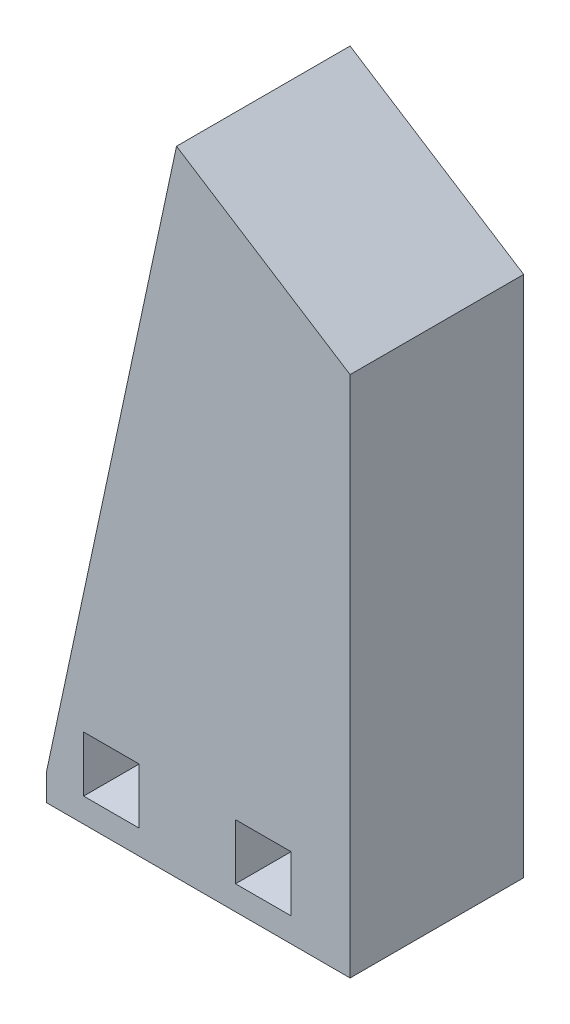
ISO-10303-21;
HEADER;
FILE_DESCRIPTION(('STEP AP214'),'2;1');
FILE_NAME('part.step','',(''),(''),'','','');
FILE_SCHEMA(('AUTOMOTIVE_DESIGN { 1 0 10303 214 1 1 1 1 }'));
ENDSEC;
DATA;
#1=APPLICATION_CONTEXT('core data for automotive mechanical design processes');
#2=APPLICATION_PROTOCOL_DEFINITION('international standard','automotive_design',2000,#1);
#3=PRODUCT_CONTEXT('',#1,'mechanical');
#4=PRODUCT('Part','Part','',(#3));
#5=PRODUCT_RELATED_PRODUCT_CATEGORY('part','',(#4));
#6=PRODUCT_DEFINITION_FORMATION('','',#4);
#7=PRODUCT_DEFINITION_CONTEXT('part definition',#1,'design');
#8=PRODUCT_DEFINITION('design','',#6,#7);
#9=PRODUCT_DEFINITION_SHAPE('','',#8);
#10=(LENGTH_UNIT() NAMED_UNIT(*) SI_UNIT(.MILLI.,.METRE.));
#11=(NAMED_UNIT(*) PLANE_ANGLE_UNIT() SI_UNIT($,.RADIAN.));
#12=(NAMED_UNIT(*) SI_UNIT($,.STERADIAN.) SOLID_ANGLE_UNIT());
#13=UNCERTAINTY_MEASURE_WITH_UNIT(LENGTH_MEASURE(1.E-05),#10,'distance_accuracy_value','');
#14=(GEOMETRIC_REPRESENTATION_CONTEXT(3) GLOBAL_UNCERTAINTY_ASSIGNED_CONTEXT((#13)) GLOBAL_UNIT_ASSIGNED_CONTEXT((#10,
#11,#12)) REPRESENTATION_CONTEXT('',''));
#15=CARTESIAN_POINT('',(0.,0.,0.));
#16=DIRECTION('',(0.,0.,1.));
#17=DIRECTION('',(1.,0.,0.));
#18=AXIS2_PLACEMENT_3D('',#15,#16,#17);
#19=CARTESIAN_POINT('',(0.,-72.9955774548661,20.));
#20=DIRECTION('',(0.,1.,0.));
#21=DIRECTION('',(0.,0.,1.));
#22=AXIS2_PLACEMENT_3D('',#19,#20,#21);
#23=PLANE('',#22);
#24=CARTESIAN_POINT('',(10.,-72.9955774548661,10.));
#25=DIRECTION('',(0.,-1.,0.));
#26=DIRECTION('',(0.,0.,-1.));
#27=AXIS2_PLACEMENT_3D('',#24,#25,#26);
#28=CIRCLE('',#27,1.6);
#29=CARTESIAN_POINT('',(10.,-72.9955774548661,8.4));
#30=VERTEX_POINT('',#29);
#31=EDGE_CURVE('E235',#30,#30,#28,.T.);
#32=ORIENTED_EDGE('',*,*,#31,.F.);
#33=EDGE_LOOP('',(#32));
#34=FACE_BOUND('',#33,.T.);
#35=CARTESIAN_POINT('',(-7.5,-72.9955774548661,10.));
#36=DIRECTION('',(0.,-1.,0.));
#37=DIRECTION('',(0.,0.,-1.));
#38=AXIS2_PLACEMENT_3D('',#35,#36,#37);
#39=CIRCLE('',#38,1.6);
#40=CARTESIAN_POINT('',(-7.5,-72.9955774548661,8.4));
#41=VERTEX_POINT('',#40);
#42=EDGE_CURVE('E240',#41,#41,#39,.T.);
#43=ORIENTED_EDGE('',*,*,#42,.F.);
#44=EDGE_LOOP('',(#43));
#45=FACE_BOUND('',#44,.T.);
#46=DIRECTION('',(1.,0.,0.));
#47=VECTOR('',#46,1.);
#48=CARTESIAN_POINT('',(0.,-72.9955774548661,0.));
#49=LINE('',#48,#47);
#50=CARTESIAN_POINT('',(-15.,-72.9955774548661,0.));
#51=VERTEX_POINT('',#50);
#52=CARTESIAN_POINT('',(20.,-72.9955774548661,0.));
#53=VERTEX_POINT('',#52);
#54=EDGE_CURVE('E208',#51,#53,#49,.T.);
#55=ORIENTED_EDGE('',*,*,#54,.T.);
#56=DIRECTION('',(0.,0.,-1.));
#57=VECTOR('',#56,1.);
#58=CARTESIAN_POINT('',(20.,-72.9955774548661,20.));
#59=LINE('',#58,#57);
#60=CARTESIAN_POINT('',(20.,-72.9955774548661,20.));
#61=VERTEX_POINT('',#60);
#62=EDGE_CURVE('E12',#61,#53,#59,.T.);
#63=ORIENTED_EDGE('',*,*,#62,.F.);
#64=DIRECTION('',(1.,0.,0.));
#65=VECTOR('',#64,1.);
#66=CARTESIAN_POINT('',(0.,-72.9955774548661,20.));
#67=LINE('',#66,#65);
#68=CARTESIAN_POINT('',(-15.,-72.9955774548661,20.));
#69=VERTEX_POINT('',#68);
#70=EDGE_CURVE('E218',#69,#61,#67,.T.);
#71=ORIENTED_EDGE('',*,*,#70,.F.);
#72=DIRECTION('',(0.,0.,1.));
#73=VECTOR('',#72,1.);
#74=CARTESIAN_POINT('',(-15.,-72.9955774548661,-74.5208315034753));
#75=LINE('',#74,#73);
#76=EDGE_CURVE('E206',#51,#69,#75,.T.);
#77=ORIENTED_EDGE('',*,*,#76,.F.);
#78=EDGE_LOOP('',(#55,#63,#71,#77));
#79=FACE_BOUND('',#78,.T.);
#80=ADVANCED_FACE('F43',(#34,#45,#79),#23,.F.);
#81=CARTESIAN_POINT('',(20.,-12.7905336116527,20.));
#82=DIRECTION('',(-1.,0.,0.));
#83=DIRECTION('',(0.,-1.,0.));
#84=AXIS2_PLACEMENT_3D('',#81,#82,#83);
#85=PLANE('',#84);
#86=DIRECTION('',(0.,1.,0.));
#87=VECTOR('',#86,1.);
#88=CARTESIAN_POINT('',(20.,-12.7905336116527,0.));
#89=LINE('',#88,#87);
#90=CARTESIAN_POINT('',(20.,-12.7905336116527,0.));
#91=VERTEX_POINT('',#90);
#92=EDGE_CURVE('E227',#53,#91,#89,.T.);
#93=ORIENTED_EDGE('',*,*,#92,.T.);
#94=DIRECTION('',(0.,0.,-1.));
#95=VECTOR('',#94,1.);
#96=CARTESIAN_POINT('',(20.,-12.7905336116527,20.));
#97=LINE('',#96,#95);
#98=CARTESIAN_POINT('',(20.,-12.7905336116527,20.));
#99=VERTEX_POINT('',#98);
#100=EDGE_CURVE('E51',#99,#91,#97,.T.);
#101=ORIENTED_EDGE('',*,*,#100,.F.);
#102=DIRECTION('',(0.,1.,0.));
#103=VECTOR('',#102,1.);
#104=CARTESIAN_POINT('',(20.,-12.7905336116527,20.));
#105=LINE('',#104,#103);
#106=EDGE_CURVE('E220',#61,#99,#105,.T.);
#107=ORIENTED_EDGE('',*,*,#106,.F.);
#108=ORIENTED_EDGE('',*,*,#62,.T.);
#109=EDGE_LOOP('',(#93,#101,#107,#108));
#110=FACE_BOUND('',#109,.T.);
#111=ADVANCED_FACE('F271',(#110),#85,.F.);
#112=CARTESIAN_POINT('',(0.,0.,20.));
#113=DIRECTION('',(-0.538770785006864,-0.842452397007147,0.));
#114=DIRECTION('',(0.842452397007147,-0.538770785006864,0.));
#115=AXIS2_PLACEMENT_3D('',#112,#113,#114);
#116=PLANE('',#115);
#117=DIRECTION('',(-0.842452397007147,0.538770785006864,0.));
#118=VECTOR('',#117,1.);
#119=CARTESIAN_POINT('',(0.,0.,0.));
#120=LINE('',#119,#118);
#121=CARTESIAN_POINT('',(0.,0.,0.));
#122=VERTEX_POINT('',#121);
#123=EDGE_CURVE('E221',#91,#122,#120,.T.);
#124=ORIENTED_EDGE('',*,*,#123,.T.);
#125=DIRECTION('',(0.,0.,-1.));
#126=VECTOR('',#125,1.);
#127=CARTESIAN_POINT('',(0.,0.,20.));
#128=LINE('',#127,#126);
#129=CARTESIAN_POINT('',(0.,0.,20.));
#130=VERTEX_POINT('',#129);
#131=EDGE_CURVE('E225',#130,#122,#128,.T.);
#132=ORIENTED_EDGE('',*,*,#131,.F.);
#133=DIRECTION('',(-0.842452397007147,0.538770785006864,0.));
#134=VECTOR('',#133,1.);
#135=CARTESIAN_POINT('',(0.,0.,20.));
#136=LINE('',#135,#134);
#137=EDGE_CURVE('E223',#99,#130,#136,.T.);
#138=ORIENTED_EDGE('',*,*,#137,.F.);
#139=ORIENTED_EDGE('',*,*,#100,.T.);
#140=EDGE_LOOP('',(#124,#132,#138,#139));
#141=FACE_BOUND('',#140,.T.);
#142=ADVANCED_FACE('F278',(#141),#116,.F.);
#143=CARTESIAN_POINT('',(0.,0.,20.));
#144=DIRECTION('',(0.,0.,1.));
#145=DIRECTION('',(1.,0.,0.));
#146=AXIS2_PLACEMENT_3D('',#143,#144,#145);
#147=PLANE('',#146);
#148=DIRECTION('',(-1.,0.,0.));
#149=VECTOR('',#148,1.);
#150=CARTESIAN_POINT('',(-10.7,-63.7955774548661,20.));
#151=LINE('',#150,#149);
#152=CARTESIAN_POINT('',(-4.3,-63.7955774548661,20.));
#153=VERTEX_POINT('',#152);
#154=CARTESIAN_POINT('',(-10.7,-63.7955774548661,20.));
#155=VERTEX_POINT('',#154);
#156=EDGE_CURVE('E59',#153,#155,#151,.T.);
#157=ORIENTED_EDGE('',*,*,#156,.F.);
#158=DIRECTION('',(0.,1.,0.));
#159=VECTOR('',#158,1.);
#160=CARTESIAN_POINT('',(-4.3,-63.7955774548661,20.));
#161=LINE('',#160,#159);
#162=CARTESIAN_POINT('',(-4.3,-70.1955774548661,20.));
#163=VERTEX_POINT('',#162);
#164=EDGE_CURVE('E163',#163,#153,#161,.T.);
#165=ORIENTED_EDGE('',*,*,#164,.F.);
#166=DIRECTION('',(1.,0.,0.));
#167=VECTOR('',#166,1.);
#168=CARTESIAN_POINT('',(-10.7,-70.1955774548661,20.));
#169=LINE('',#168,#167);
#170=CARTESIAN_POINT('',(-10.7,-70.1955774548661,20.));
#171=VERTEX_POINT('',#170);
#172=EDGE_CURVE('E146',#171,#163,#169,.T.);
#173=ORIENTED_EDGE('',*,*,#172,.F.);
#174=DIRECTION('',(0.,-1.,0.));
#175=VECTOR('',#174,1.);
#176=CARTESIAN_POINT('',(-10.7,-63.7955774548661,20.));
#177=LINE('',#176,#175);
#178=EDGE_CURVE('E156',#155,#171,#177,.T.);
#179=ORIENTED_EDGE('',*,*,#178,.F.);
#180=EDGE_LOOP('',(#157,#165,#173,#179));
#181=FACE_BOUND('',#180,.T.);
#182=DIRECTION('',(-1.,0.,0.));
#183=VECTOR('',#182,1.);
#184=CARTESIAN_POINT('',(6.80000000000001,-63.7955774548661,20.));
#185=LINE('',#184,#183);
#186=CARTESIAN_POINT('',(13.2,-63.7955774548661,20.));
#187=VERTEX_POINT('',#186);
#188=CARTESIAN_POINT('',(6.80000000000001,-63.7955774548661,20.));
#189=VERTEX_POINT('',#188);
#190=EDGE_CURVE('E67',#187,#189,#185,.T.);
#191=ORIENTED_EDGE('',*,*,#190,.F.);
#192=DIRECTION('',(0.,1.,0.));
#193=VECTOR('',#192,1.);
#194=CARTESIAN_POINT('',(13.2,-63.7955774548661,20.));
#195=LINE('',#194,#193);
#196=CARTESIAN_POINT('',(13.2,-70.1955774548661,20.));
#197=VERTEX_POINT('',#196);
#198=EDGE_CURVE('E181',#197,#187,#195,.T.);
#199=ORIENTED_EDGE('',*,*,#198,.F.);
#200=DIRECTION('',(1.,0.,0.));
#201=VECTOR('',#200,1.);
#202=CARTESIAN_POINT('',(6.80000000000001,-70.1955774548661,20.));
#203=LINE('',#202,#201);
#204=CARTESIAN_POINT('',(6.80000000000001,-70.1955774548661,20.));
#205=VERTEX_POINT('',#204);
#206=EDGE_CURVE('E191',#205,#197,#203,.T.);
#207=ORIENTED_EDGE('',*,*,#206,.F.);
#208=DIRECTION('',(0.,-1.,0.));
#209=VECTOR('',#208,1.);
#210=CARTESIAN_POINT('',(6.80000000000001,-63.7955774548661,20.));
#211=LINE('',#210,#209);
#212=EDGE_CURVE('E194',#189,#205,#211,.T.);
#213=ORIENTED_EDGE('',*,*,#212,.F.);
#214=EDGE_LOOP('',(#191,#199,#207,#213));
#215=FACE_BOUND('',#214,.T.);
#216=ORIENTED_EDGE('',*,*,#137,.T.);
#217=DIRECTION('',(-0.209541746186117,-0.977799701679885,0.));
#218=VECTOR('',#217,1.);
#219=CARTESIAN_POINT('',(-15.,-69.9955774548661,20.));
#220=LINE('',#219,#218);
#221=CARTESIAN_POINT('',(-15.,-69.9955774548661,20.));
#222=VERTEX_POINT('',#221);
#223=EDGE_CURVE('E174',#130,#222,#220,.T.);
#224=ORIENTED_EDGE('',*,*,#223,.T.);
#225=DIRECTION('',(0.,-1.,0.));
#226=VECTOR('',#225,1.);
#227=CARTESIAN_POINT('',(-15.,-72.9955774548661,20.));
#228=LINE('',#227,#226);
#229=EDGE_CURVE('E211',#222,#69,#228,.T.);
#230=ORIENTED_EDGE('',*,*,#229,.T.);
#231=ORIENTED_EDGE('',*,*,#70,.T.);
#232=ORIENTED_EDGE('',*,*,#106,.T.);
#233=EDGE_LOOP('',(#216,#224,#230,#231,#232));
#234=FACE_BOUND('',#233,.T.);
#235=ADVANCED_FACE('F160',(#181,#215,#234),#147,.T.);
#236=CARTESIAN_POINT('',(0.,0.,0.));
#237=DIRECTION('',(0.,0.,1.));
#238=DIRECTION('',(1.,0.,0.));
#239=AXIS2_PLACEMENT_3D('',#236,#237,#238);
#240=PLANE('',#239);
#241=ORIENTED_EDGE('',*,*,#54,.F.);
#242=DIRECTION('',(0.,1.,0.));
#243=VECTOR('',#242,1.);
#244=CARTESIAN_POINT('',(-15.,-72.9955774548661,0.));
#245=LINE('',#244,#243);
#246=CARTESIAN_POINT('',(-15.,-69.9955774548661,0.));
#247=VERTEX_POINT('',#246);
#248=EDGE_CURVE('E205',#51,#247,#245,.T.);
#249=ORIENTED_EDGE('',*,*,#248,.T.);
#250=DIRECTION('',(0.209541746186117,0.977799701679886,0.));
#251=VECTOR('',#250,1.);
#252=CARTESIAN_POINT('',(-15.,-69.9955774548661,0.));
#253=LINE('',#252,#251);
#254=EDGE_CURVE('E202',#247,#122,#253,.T.);
#255=ORIENTED_EDGE('',*,*,#254,.T.);
#256=ORIENTED_EDGE('',*,*,#123,.F.);
#257=ORIENTED_EDGE('',*,*,#92,.F.);
#258=EDGE_LOOP('',(#241,#249,#255,#256,#257));
#259=FACE_BOUND('',#258,.T.);
#260=ADVANCED_FACE('F291',(#259),#240,.F.);
#261=CARTESIAN_POINT('',(-15.,-72.9955774548661,-74.5208315034753));
#262=DIRECTION('',(-1.,0.,0.));
#263=DIRECTION('',(0.,0.,1.));
#264=AXIS2_PLACEMENT_3D('',#261,#262,#263);
#265=PLANE('',#264);
#266=ORIENTED_EDGE('',*,*,#248,.F.);
#267=ORIENTED_EDGE('',*,*,#76,.T.);
#268=ORIENTED_EDGE('',*,*,#229,.F.);
#269=DIRECTION('',(0.,0.,1.));
#270=VECTOR('',#269,1.);
#271=CARTESIAN_POINT('',(-15.,-69.9955774548661,-74.5208315034753));
#272=LINE('',#271,#270);
#273=EDGE_CURVE('E214',#247,#222,#272,.T.);
#274=ORIENTED_EDGE('',*,*,#273,.F.);
#275=EDGE_LOOP('',(#266,#267,#268,#274));
#276=FACE_BOUND('',#275,.T.);
#277=ADVANCED_FACE('F300',(#276),#265,.T.);
#278=CARTESIAN_POINT('',(-15.,-69.9955774548661,-74.5208315034753));
#279=DIRECTION('',(-0.977799701679885,0.209541746186117,0.));
#280=DIRECTION('',(-0.209541746186117,-0.977799701679886,0.));
#281=AXIS2_PLACEMENT_3D('',#278,#279,#280);
#282=PLANE('',#281);
#283=ORIENTED_EDGE('',*,*,#254,.F.);
#284=ORIENTED_EDGE('',*,*,#273,.T.);
#285=ORIENTED_EDGE('',*,*,#223,.F.);
#286=ORIENTED_EDGE('',*,*,#131,.T.);
#287=EDGE_LOOP('',(#283,#284,#285,#286));
#288=FACE_BOUND('',#287,.T.);
#289=ADVANCED_FACE('F303',(#288),#282,.T.);
#290=CARTESIAN_POINT('',(6.80000000000001,-63.7955774548661,-9.05096679918781));
#291=DIRECTION('',(0.,1.,0.));
#292=DIRECTION('',(0.,0.,1.));
#293=AXIS2_PLACEMENT_3D('',#290,#291,#292);
#294=PLANE('',#293);
#295=DIRECTION('',(1.,0.,0.));
#296=VECTOR('',#295,1.);
#297=CARTESIAN_POINT('',(6.80000000000001,-63.7955774548661,6.9));
#298=LINE('',#297,#296);
#299=CARTESIAN_POINT('',(6.80000000000001,-63.7955774548661,6.9));
#300=VERTEX_POINT('',#299);
#301=CARTESIAN_POINT('',(13.2,-63.7955774548661,6.9));
#302=VERTEX_POINT('',#301);
#303=EDGE_CURVE('E178',#300,#302,#298,.T.);
#304=ORIENTED_EDGE('',*,*,#303,.T.);
#305=DIRECTION('',(0.,0.,1.));
#306=VECTOR('',#305,1.);
#307=CARTESIAN_POINT('',(13.2,-63.7955774548661,-9.05096679918781));
#308=LINE('',#307,#306);
#309=EDGE_CURVE('E186',#302,#187,#308,.T.);
#310=ORIENTED_EDGE('',*,*,#309,.T.);
#311=ORIENTED_EDGE('',*,*,#190,.T.);
#312=DIRECTION('',(0.,0.,1.));
#313=VECTOR('',#312,1.);
#314=CARTESIAN_POINT('',(6.80000000000001,-63.7955774548661,-9.05096679918781));
#315=LINE('',#314,#313);
#316=EDGE_CURVE('E179',#300,#189,#315,.T.);
#317=ORIENTED_EDGE('',*,*,#316,.F.);
#318=EDGE_LOOP('',(#304,#310,#311,#317));
#319=FACE_BOUND('',#318,.T.);
#320=ADVANCED_FACE('F305',(#319),#294,.F.);
#321=CARTESIAN_POINT('',(13.2,-63.7955774548661,-9.05096679918781));
#322=DIRECTION('',(1.,0.,0.));
#323=DIRECTION('',(0.,0.,-1.));
#324=AXIS2_PLACEMENT_3D('',#321,#322,#323);
#325=PLANE('',#324);
#326=DIRECTION('',(0.,-1.,0.));
#327=VECTOR('',#326,1.);
#328=CARTESIAN_POINT('',(13.2,-63.7955774548661,6.9));
#329=LINE('',#328,#327);
#330=CARTESIAN_POINT('',(13.2,-70.1955774548661,6.9));
#331=VERTEX_POINT('',#330);
#332=EDGE_CURVE('E199',#302,#331,#329,.T.);
#333=ORIENTED_EDGE('',*,*,#332,.T.);
#334=DIRECTION('',(0.,0.,1.));
#335=VECTOR('',#334,1.);
#336=CARTESIAN_POINT('',(13.2,-70.1955774548661,-9.05096679918781));
#337=LINE('',#336,#335);
#338=EDGE_CURVE('E184',#331,#197,#337,.T.);
#339=ORIENTED_EDGE('',*,*,#338,.T.);
#340=ORIENTED_EDGE('',*,*,#198,.T.);
#341=ORIENTED_EDGE('',*,*,#309,.F.);
#342=EDGE_LOOP('',(#333,#339,#340,#341));
#343=FACE_BOUND('',#342,.T.);
#344=ADVANCED_FACE('F311',(#343),#325,.F.);
#345=CARTESIAN_POINT('',(6.80000000000001,-70.1955774548661,-9.05096679918781));
#346=DIRECTION('',(0.,-1.,0.));
#347=DIRECTION('',(0.,0.,-1.));
#348=AXIS2_PLACEMENT_3D('',#345,#346,#347);
#349=PLANE('',#348);
#350=CARTESIAN_POINT('',(10.,-70.1955774548661,10.));
#351=DIRECTION('',(0.,-1.,0.));
#352=DIRECTION('',(0.,0.,-1.));
#353=AXIS2_PLACEMENT_3D('',#350,#351,#352);
#354=CIRCLE('',#353,1.6);
#355=CARTESIAN_POINT('',(10.,-70.1955774548661,8.4));
#356=VERTEX_POINT('',#355);
#357=EDGE_CURVE('E46',#356,#356,#354,.T.);
#358=ORIENTED_EDGE('',*,*,#357,.T.);
#359=EDGE_LOOP('',(#358));
#360=FACE_BOUND('',#359,.T.);
#361=DIRECTION('',(-1.,0.,0.));
#362=VECTOR('',#361,1.);
#363=CARTESIAN_POINT('',(6.80000000000001,-70.1955774548661,6.9));
#364=LINE('',#363,#362);
#365=CARTESIAN_POINT('',(6.80000000000001,-70.1955774548661,6.9));
#366=VERTEX_POINT('',#365);
#367=EDGE_CURVE('E188',#331,#366,#364,.T.);
#368=ORIENTED_EDGE('',*,*,#367,.T.);
#369=DIRECTION('',(0.,0.,1.));
#370=VECTOR('',#369,1.);
#371=CARTESIAN_POINT('',(6.80000000000001,-70.1955774548661,-9.05096679918781));
#372=LINE('',#371,#370);
#373=EDGE_CURVE('E182',#366,#205,#372,.T.);
#374=ORIENTED_EDGE('',*,*,#373,.T.);
#375=ORIENTED_EDGE('',*,*,#206,.T.);
#376=ORIENTED_EDGE('',*,*,#338,.F.);
#377=EDGE_LOOP('',(#368,#374,#375,#376));
#378=FACE_BOUND('',#377,.T.);
#379=ADVANCED_FACE('F358',(#360,#378),#349,.F.);
#380=CARTESIAN_POINT('',(6.80000000000001,-63.7955774548661,-9.05096679918781));
#381=DIRECTION('',(-1.,0.,0.));
#382=DIRECTION('',(0.,0.,1.));
#383=AXIS2_PLACEMENT_3D('',#380,#381,#382);
#384=PLANE('',#383);
#385=DIRECTION('',(0.,1.,0.));
#386=VECTOR('',#385,1.);
#387=CARTESIAN_POINT('',(6.80000000000001,-63.7955774548661,6.9));
#388=LINE('',#387,#386);
#389=EDGE_CURVE('E176',#366,#300,#388,.T.);
#390=ORIENTED_EDGE('',*,*,#389,.T.);
#391=ORIENTED_EDGE('',*,*,#316,.T.);
#392=ORIENTED_EDGE('',*,*,#212,.T.);
#393=ORIENTED_EDGE('',*,*,#373,.F.);
#394=EDGE_LOOP('',(#390,#391,#392,#393));
#395=FACE_BOUND('',#394,.T.);
#396=ADVANCED_FACE('F368',(#395),#384,.F.);
#397=CARTESIAN_POINT('',(0.,0.,6.9));
#398=DIRECTION('',(0.,0.,1.));
#399=DIRECTION('',(1.,0.,0.));
#400=AXIS2_PLACEMENT_3D('',#397,#398,#399);
#401=PLANE('',#400);
#402=ORIENTED_EDGE('',*,*,#303,.F.);
#403=ORIENTED_EDGE('',*,*,#389,.F.);
#404=ORIENTED_EDGE('',*,*,#367,.F.);
#405=ORIENTED_EDGE('',*,*,#332,.F.);
#406=EDGE_LOOP('',(#402,#403,#404,#405));
#407=FACE_BOUND('',#406,.T.);
#408=ADVANCED_FACE('F267',(#407),#401,.T.);
#409=CARTESIAN_POINT('',(-10.7,-63.7955774548661,-9.05096679918781));
#410=DIRECTION('',(0.,1.,0.));
#411=DIRECTION('',(0.,0.,1.));
#412=AXIS2_PLACEMENT_3D('',#409,#410,#411);
#413=PLANE('',#412);
#414=DIRECTION('',(1.,0.,0.));
#415=VECTOR('',#414,1.);
#416=CARTESIAN_POINT('',(-10.7,-63.7955774548661,6.9));
#417=LINE('',#416,#415);
#418=CARTESIAN_POINT('',(-10.7,-63.7955774548661,6.9));
#419=VERTEX_POINT('',#418);
#420=CARTESIAN_POINT('',(-4.3,-63.7955774548661,6.9));
#421=VERTEX_POINT('',#420);
#422=EDGE_CURVE('E175',#419,#421,#417,.T.);
#423=ORIENTED_EDGE('',*,*,#422,.T.);
#424=DIRECTION('',(0.,0.,1.));
#425=VECTOR('',#424,1.);
#426=CARTESIAN_POINT('',(-4.3,-63.7955774548661,-9.05096679918781));
#427=LINE('',#426,#425);
#428=EDGE_CURVE('E168',#421,#153,#427,.T.);
#429=ORIENTED_EDGE('',*,*,#428,.T.);
#430=ORIENTED_EDGE('',*,*,#156,.T.);
#431=DIRECTION('',(0.,0.,1.));
#432=VECTOR('',#431,1.);
#433=CARTESIAN_POINT('',(-10.7,-63.7955774548661,-9.05096679918781));
#434=LINE('',#433,#432);
#435=EDGE_CURVE('E153',#419,#155,#434,.T.);
#436=ORIENTED_EDGE('',*,*,#435,.F.);
#437=EDGE_LOOP('',(#423,#429,#430,#436));
#438=FACE_BOUND('',#437,.T.);
#439=ADVANCED_FACE('F252',(#438),#413,.F.);
#440=CARTESIAN_POINT('',(-4.3,-63.7955774548661,-9.05096679918781));
#441=DIRECTION('',(1.,0.,0.));
#442=DIRECTION('',(0.,1.,0.));
#443=AXIS2_PLACEMENT_3D('',#440,#441,#442);
#444=PLANE('',#443);
#445=DIRECTION('',(0.,-1.,0.));
#446=VECTOR('',#445,1.);
#447=CARTESIAN_POINT('',(-4.3,-63.7955774548661,6.9));
#448=LINE('',#447,#446);
#449=CARTESIAN_POINT('',(-4.3,-70.1955774548661,6.9));
#450=VERTEX_POINT('',#449);
#451=EDGE_CURVE('E248',#421,#450,#448,.T.);
#452=ORIENTED_EDGE('',*,*,#451,.T.);
#453=DIRECTION('',(0.,0.,1.));
#454=VECTOR('',#453,1.);
#455=CARTESIAN_POINT('',(-4.3,-70.1955774548661,-9.05096679918781));
#456=LINE('',#455,#454);
#457=EDGE_CURVE('E152',#450,#163,#456,.T.);
#458=ORIENTED_EDGE('',*,*,#457,.T.);
#459=ORIENTED_EDGE('',*,*,#164,.T.);
#460=ORIENTED_EDGE('',*,*,#428,.F.);
#461=EDGE_LOOP('',(#452,#458,#459,#460));
#462=FACE_BOUND('',#461,.T.);
#463=ADVANCED_FACE('F257',(#462),#444,.F.);
#464=CARTESIAN_POINT('',(-10.7,-70.1955774548661,-9.05096679918781));
#465=DIRECTION('',(0.,-1.,0.));
#466=DIRECTION('',(0.,0.,-1.));
#467=AXIS2_PLACEMENT_3D('',#464,#465,#466);
#468=PLANE('',#467);
#469=CARTESIAN_POINT('',(-7.5,-70.1955774548661,10.));
#470=DIRECTION('',(0.,-1.,0.));
#471=DIRECTION('',(0.,0.,-1.));
#472=AXIS2_PLACEMENT_3D('',#469,#470,#471);
#473=CIRCLE('',#472,1.6);
#474=CARTESIAN_POINT('',(-7.5,-70.1955774548661,8.4));
#475=VERTEX_POINT('',#474);
#476=EDGE_CURVE('E233',#475,#475,#473,.T.);
#477=ORIENTED_EDGE('',*,*,#476,.T.);
#478=EDGE_LOOP('',(#477));
#479=FACE_BOUND('',#478,.T.);
#480=DIRECTION('',(-1.,0.,0.));
#481=VECTOR('',#480,1.);
#482=CARTESIAN_POINT('',(-10.7,-70.1955774548661,6.9));
#483=LINE('',#482,#481);
#484=CARTESIAN_POINT('',(-10.7,-70.1955774548661,6.9));
#485=VERTEX_POINT('',#484);
#486=EDGE_CURVE('E149',#450,#485,#483,.T.);
#487=ORIENTED_EDGE('',*,*,#486,.T.);
#488=DIRECTION('',(0.,0.,1.));
#489=VECTOR('',#488,1.);
#490=CARTESIAN_POINT('',(-10.7,-70.1955774548661,-9.05096679918781));
#491=LINE('',#490,#489);
#492=EDGE_CURVE('E141',#485,#171,#491,.T.);
#493=ORIENTED_EDGE('',*,*,#492,.T.);
#494=ORIENTED_EDGE('',*,*,#172,.T.);
#495=ORIENTED_EDGE('',*,*,#457,.F.);
#496=EDGE_LOOP('',(#487,#493,#494,#495));
#497=FACE_BOUND('',#496,.T.);
#498=ADVANCED_FACE('F143',(#479,#497),#468,.F.);
#499=CARTESIAN_POINT('',(-10.7,-63.7955774548661,-9.05096679918781));
#500=DIRECTION('',(-1.,0.,0.));
#501=DIRECTION('',(0.,0.,1.));
#502=AXIS2_PLACEMENT_3D('',#499,#500,#501);
#503=PLANE('',#502);
#504=DIRECTION('',(0.,1.,0.));
#505=VECTOR('',#504,1.);
#506=CARTESIAN_POINT('',(-10.7,-63.7955774548661,6.9));
#507=LINE('',#506,#505);
#508=EDGE_CURVE('E172',#485,#419,#507,.T.);
#509=ORIENTED_EDGE('',*,*,#508,.T.);
#510=ORIENTED_EDGE('',*,*,#435,.T.);
#511=ORIENTED_EDGE('',*,*,#178,.T.);
#512=ORIENTED_EDGE('',*,*,#492,.F.);
#513=EDGE_LOOP('',(#509,#510,#511,#512));
#514=FACE_BOUND('',#513,.T.);
#515=ADVANCED_FACE('F157',(#514),#503,.F.);
#516=CARTESIAN_POINT('',(0.,0.,6.9));
#517=DIRECTION('',(0.,0.,1.));
#518=DIRECTION('',(1.,0.,0.));
#519=AXIS2_PLACEMENT_3D('',#516,#517,#518);
#520=PLANE('',#519);
#521=ORIENTED_EDGE('',*,*,#422,.F.);
#522=ORIENTED_EDGE('',*,*,#508,.F.);
#523=ORIENTED_EDGE('',*,*,#486,.F.);
#524=ORIENTED_EDGE('',*,*,#451,.F.);
#525=EDGE_LOOP('',(#521,#522,#523,#524));
#526=FACE_BOUND('',#525,.T.);
#527=ADVANCED_FACE('F255',(#526),#520,.T.);
#528=CARTESIAN_POINT('',(-7.5,-59.2700940552722,10.));
#529=DIRECTION('',(0.,-1.,0.));
#530=DIRECTION('',(0.,0.,-1.));
#531=AXIS2_PLACEMENT_3D('',#528,#529,#530);
#532=CYLINDRICAL_SURFACE('',#531,1.6);
#533=ORIENTED_EDGE('',*,*,#42,.T.);
#534=EDGE_LOOP('',(#533));
#535=FACE_BOUND('',#534,.T.);
#536=ORIENTED_EDGE('',*,*,#476,.F.);
#537=EDGE_LOOP('',(#536));
#538=FACE_BOUND('',#537,.T.);
#539=ADVANCED_FACE('F416',(#535,#538),#532,.F.);
#540=CARTESIAN_POINT('',(10.,-59.2700940552722,10.));
#541=DIRECTION('',(0.,-1.,0.));
#542=DIRECTION('',(0.,0.,-1.));
#543=AXIS2_PLACEMENT_3D('',#540,#541,#542);
#544=CYLINDRICAL_SURFACE('',#543,1.6);
#545=ORIENTED_EDGE('',*,*,#31,.T.);
#546=EDGE_LOOP('',(#545));
#547=FACE_BOUND('',#546,.T.);
#548=ORIENTED_EDGE('',*,*,#357,.F.);
#549=EDGE_LOOP('',(#548));
#550=FACE_BOUND('',#549,.T.);
#551=ADVANCED_FACE('F423',(#547,#550),#544,.F.);
#552=CLOSED_SHELL('',(#80,#111,#142,#235,#260,#277,#289,#320,#344,#379,#396,#408,#439,#463,#498,
#515,#527,#539,#551));
#553=MANIFOLD_SOLID_BREP('B2',#552);
#554=ADVANCED_BREP_SHAPE_REPRESENTATION('',(#18,#553),#14);
#555=SHAPE_DEFINITION_REPRESENTATION(#9,#554);
ENDSEC;
END-ISO-10303-21;
